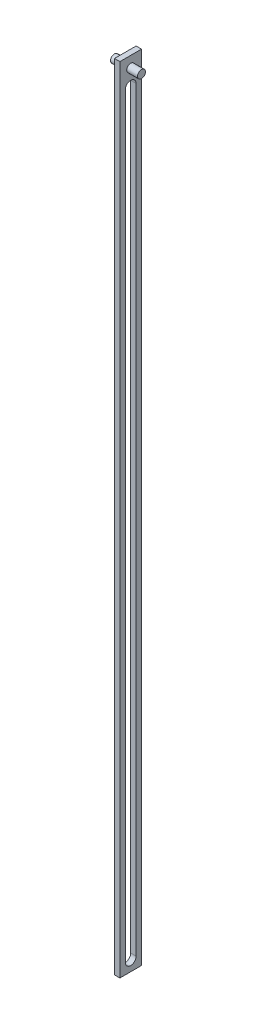
ISO-10303-21;
HEADER;
FILE_DESCRIPTION(('STEP AP214'),'2;1');
FILE_NAME('part.step','',(''),(''),'','','');
FILE_SCHEMA(('AUTOMOTIVE_DESIGN { 1 0 10303 214 1 1 1 1 }'));
ENDSEC;
DATA;
#1=APPLICATION_CONTEXT('core data for automotive mechanical design processes');
#2=APPLICATION_PROTOCOL_DEFINITION('international standard','automotive_design',2000,#1);
#3=PRODUCT_CONTEXT('',#1,'mechanical');
#4=PRODUCT('Part','Part','',(#3));
#5=PRODUCT_RELATED_PRODUCT_CATEGORY('part','',(#4));
#6=PRODUCT_DEFINITION_FORMATION('','',#4);
#7=PRODUCT_DEFINITION_CONTEXT('part definition',#1,'design');
#8=PRODUCT_DEFINITION('design','',#6,#7);
#9=PRODUCT_DEFINITION_SHAPE('','',#8);
#10=(LENGTH_UNIT() NAMED_UNIT(*) SI_UNIT(.MILLI.,.METRE.));
#11=(NAMED_UNIT(*) PLANE_ANGLE_UNIT() SI_UNIT($,.RADIAN.));
#12=(NAMED_UNIT(*) SI_UNIT($,.STERADIAN.) SOLID_ANGLE_UNIT());
#13=UNCERTAINTY_MEASURE_WITH_UNIT(LENGTH_MEASURE(1.E-05),#10,'distance_accuracy_value','');
#14=(GEOMETRIC_REPRESENTATION_CONTEXT(3) GLOBAL_UNCERTAINTY_ASSIGNED_CONTEXT((#13)) GLOBAL_UNIT_ASSIGNED_CONTEXT((#10,
#11,#12)) REPRESENTATION_CONTEXT('',''));
#15=CARTESIAN_POINT('',(0.,0.,0.));
#16=DIRECTION('',(0.,0.,1.));
#17=DIRECTION('',(1.,0.,0.));
#18=AXIS2_PLACEMENT_3D('',#15,#16,#17);
#19=CARTESIAN_POINT('',(3.175,0.,0.));
#20=DIRECTION('',(-1.,0.,0.));
#21=DIRECTION('',(0.,0.,1.));
#22=AXIS2_PLACEMENT_3D('',#19,#20,#21);
#23=PLANE('',#22);
#24=CARTESIAN_POINT('',(3.175,430.048055815008,4.08113084904235));
#25=DIRECTION('',(-1.,0.,0.));
#26=DIRECTION('',(0.,0.,1.));
#27=AXIS2_PLACEMENT_3D('',#24,#25,#26);
#28=CIRCLE('',#27,2.33731121200248);
#29=CARTESIAN_POINT('',(3.175,430.048055815008,1.74381963703987));
#30=VERTEX_POINT('',#29);
#31=EDGE_CURVE('E126',#30,#30,#28,.T.);
#32=ORIENTED_EDGE('',*,*,#31,.T.);
#33=EDGE_LOOP('',(#32));
#34=FACE_BOUND('',#33,.T.);
#35=DIRECTION('',(0.,1.,0.));
#36=VECTOR('',#35,1.);
#37=CARTESIAN_POINT('',(3.175,-30.326944184992,-2.26886915095765));
#38=LINE('',#37,#36);
#39=CARTESIAN_POINT('',(3.175,-30.326944184992,-2.26886915095765));
#40=VERTEX_POINT('',#39);
#41=CARTESIAN_POINT('',(3.175,436.398055815008,-2.26886915095765));
#42=VERTEX_POINT('',#41);
#43=EDGE_CURVE('E100',#40,#42,#38,.T.);
#44=ORIENTED_EDGE('',*,*,#43,.T.);
#45=DIRECTION('',(0.,0.,-1.));
#46=VECTOR('',#45,1.);
#47=CARTESIAN_POINT('',(3.175,436.398055815008,10.4311308490423));
#48=LINE('',#47,#46);
#49=CARTESIAN_POINT('',(3.175,436.398055815008,10.4311308490423));
#50=VERTEX_POINT('',#49);
#51=EDGE_CURVE('E104',#50,#42,#48,.T.);
#52=ORIENTED_EDGE('',*,*,#51,.F.);
#53=DIRECTION('',(0.,-1.,0.));
#54=VECTOR('',#53,1.);
#55=CARTESIAN_POINT('',(3.175,-30.326944184992,10.4311308490423));
#56=LINE('',#55,#54);
#57=CARTESIAN_POINT('',(3.175,-30.326944184992,10.4311308490423));
#58=VERTEX_POINT('',#57);
#59=EDGE_CURVE('E110',#50,#58,#56,.T.);
#60=ORIENTED_EDGE('',*,*,#59,.T.);
#61=DIRECTION('',(0.,0.,-1.));
#62=VECTOR('',#61,1.);
#63=CARTESIAN_POINT('',(3.175,-30.326944184992,10.4311308490423));
#64=LINE('',#63,#62);
#65=EDGE_CURVE('E106',#58,#40,#64,.T.);
#66=ORIENTED_EDGE('',*,*,#65,.T.);
#67=EDGE_LOOP('',(#44,#52,#60,#66));
#68=FACE_BOUND('',#67,.T.);
#69=CARTESIAN_POINT('',(3.175,-23.976944184992,4.08113084904236));
#70=DIRECTION('',(1.,0.,0.));
#71=DIRECTION('',(0.,0.,-1.));
#72=AXIS2_PLACEMENT_3D('',#69,#70,#71);
#73=CIRCLE('',#72,3.175);
#74=CARTESIAN_POINT('',(3.175,-23.976944184992,7.25613084904236));
#75=VERTEX_POINT('',#74);
#76=CARTESIAN_POINT('',(3.175,-23.976944184992,0.906130849042361));
#77=VERTEX_POINT('',#76);
#78=EDGE_CURVE('E135',#75,#77,#73,.T.);
#79=ORIENTED_EDGE('',*,*,#78,.F.);
#80=DIRECTION('',(0.,-1.,0.));
#81=VECTOR('',#80,1.);
#82=CARTESIAN_POINT('',(3.175,-23.976944184992,7.25613084904236));
#83=LINE('',#82,#81);
#84=CARTESIAN_POINT('',(3.175,420.523055815008,7.25613084904244));
#85=VERTEX_POINT('',#84);
#86=EDGE_CURVE('E142',#85,#75,#83,.T.);
#87=ORIENTED_EDGE('',*,*,#86,.F.);
#88=CARTESIAN_POINT('',(3.175,420.523055815008,4.08113084904244));
#89=DIRECTION('',(1.,0.,0.));
#90=DIRECTION('',(0.,0.,-1.));
#91=AXIS2_PLACEMENT_3D('',#88,#89,#90);
#92=CIRCLE('',#91,3.175);
#93=CARTESIAN_POINT('',(3.175,420.523055815008,0.906130849042442));
#94=VERTEX_POINT('',#93);
#95=EDGE_CURVE('E140',#94,#85,#92,.T.);
#96=ORIENTED_EDGE('',*,*,#95,.F.);
#97=DIRECTION('',(0.,1.,0.));
#98=VECTOR('',#97,1.);
#99=CARTESIAN_POINT('',(3.175,-23.976944184992,0.906130849042361));
#100=LINE('',#99,#98);
#101=EDGE_CURVE('E137',#77,#94,#100,.T.);
#102=ORIENTED_EDGE('',*,*,#101,.F.);
#103=EDGE_LOOP('',(#79,#87,#96,#102));
#104=FACE_BOUND('',#103,.T.);
#105=ADVANCED_FACE('F33',(#34,#68,#104),#23,.F.);
#106=CARTESIAN_POINT('',(0.,0.,0.));
#107=DIRECTION('',(-1.,0.,0.));
#108=DIRECTION('',(0.,0.,1.));
#109=AXIS2_PLACEMENT_3D('',#106,#107,#108);
#110=PLANE('',#109);
#111=CARTESIAN_POINT('',(0.,430.048055815008,4.08113084904235));
#112=DIRECTION('',(-1.,0.,0.));
#113=DIRECTION('',(0.,0.,1.));
#114=AXIS2_PLACEMENT_3D('',#111,#112,#113);
#115=CIRCLE('',#114,2.33731121200248);
#116=CARTESIAN_POINT('',(0.,430.048055815008,1.74381963703987));
#117=VERTEX_POINT('',#116);
#118=EDGE_CURVE('E11',#117,#117,#115,.T.);
#119=ORIENTED_EDGE('',*,*,#118,.F.);
#120=EDGE_LOOP('',(#119));
#121=FACE_BOUND('',#120,.T.);
#122=DIRECTION('',(0.,1.,0.));
#123=VECTOR('',#122,1.);
#124=CARTESIAN_POINT('',(0.,-30.326944184992,-2.26886915095765));
#125=LINE('',#124,#123);
#126=CARTESIAN_POINT('',(0.,-30.326944184992,-2.26886915095765));
#127=VERTEX_POINT('',#126);
#128=CARTESIAN_POINT('',(0.,436.398055815008,-2.26886915095765));
#129=VERTEX_POINT('',#128);
#130=EDGE_CURVE('E116',#127,#129,#125,.T.);
#131=ORIENTED_EDGE('',*,*,#130,.F.);
#132=DIRECTION('',(0.,0.,-1.));
#133=VECTOR('',#132,1.);
#134=CARTESIAN_POINT('',(0.,-30.326944184992,10.4311308490423));
#135=LINE('',#134,#133);
#136=CARTESIAN_POINT('',(0.,-30.326944184992,10.4311308490423));
#137=VERTEX_POINT('',#136);
#138=EDGE_CURVE('E111',#137,#127,#135,.T.);
#139=ORIENTED_EDGE('',*,*,#138,.F.);
#140=DIRECTION('',(0.,-1.,0.));
#141=VECTOR('',#140,1.);
#142=CARTESIAN_POINT('',(0.,-30.326944184992,10.4311308490423));
#143=LINE('',#142,#141);
#144=CARTESIAN_POINT('',(0.,436.398055815008,10.4311308490423));
#145=VERTEX_POINT('',#144);
#146=EDGE_CURVE('E164',#145,#137,#143,.T.);
#147=ORIENTED_EDGE('',*,*,#146,.F.);
#148=DIRECTION('',(0.,0.,1.));
#149=VECTOR('',#148,1.);
#150=CARTESIAN_POINT('',(0.,436.398055815008,10.4311308490423));
#151=LINE('',#150,#149);
#152=EDGE_CURVE('E120',#129,#145,#151,.T.);
#153=ORIENTED_EDGE('',*,*,#152,.F.);
#154=EDGE_LOOP('',(#131,#139,#147,#153));
#155=FACE_BOUND('',#154,.T.);
#156=DIRECTION('',(0.,-1.,0.));
#157=VECTOR('',#156,1.);
#158=CARTESIAN_POINT('',(0.,-23.976944184992,7.25613084904236));
#159=LINE('',#158,#157);
#160=CARTESIAN_POINT('',(0.,420.523055815008,7.25613084904244));
#161=VERTEX_POINT('',#160);
#162=CARTESIAN_POINT('',(0.,-23.976944184992,7.25613084904236));
#163=VERTEX_POINT('',#162);
#164=EDGE_CURVE('E138',#161,#163,#159,.T.);
#165=ORIENTED_EDGE('',*,*,#164,.T.);
#166=CARTESIAN_POINT('',(0.,-23.976944184992,4.08113084904236));
#167=DIRECTION('',(1.,0.,0.));
#168=DIRECTION('',(0.,0.,-1.));
#169=AXIS2_PLACEMENT_3D('',#166,#167,#168);
#170=CIRCLE('',#169,3.175);
#171=CARTESIAN_POINT('',(0.,-23.976944184992,0.906130849042361));
#172=VERTEX_POINT('',#171);
#173=EDGE_CURVE('E56',#163,#172,#170,.T.);
#174=ORIENTED_EDGE('',*,*,#173,.T.);
#175=DIRECTION('',(0.,1.,0.));
#176=VECTOR('',#175,1.);
#177=CARTESIAN_POINT('',(0.,-23.976944184992,0.906130849042361));
#178=LINE('',#177,#176);
#179=CARTESIAN_POINT('',(0.,420.523055815008,0.906130849042442));
#180=VERTEX_POINT('',#179);
#181=EDGE_CURVE('E146',#172,#180,#178,.T.);
#182=ORIENTED_EDGE('',*,*,#181,.T.);
#183=CARTESIAN_POINT('',(0.,420.523055815008,4.08113084904244));
#184=DIRECTION('',(1.,0.,0.));
#185=DIRECTION('',(0.,0.,-1.));
#186=AXIS2_PLACEMENT_3D('',#183,#184,#185);
#187=CIRCLE('',#186,3.175);
#188=EDGE_CURVE('E149',#180,#161,#187,.T.);
#189=ORIENTED_EDGE('',*,*,#188,.T.);
#190=EDGE_LOOP('',(#165,#174,#182,#189));
#191=FACE_BOUND('',#190,.T.);
#192=ADVANCED_FACE('F174',(#121,#155,#191),#110,.T.);
#193=CARTESIAN_POINT('',(3.175,-30.326944184992,-2.26886915095765));
#194=DIRECTION('',(0.,0.,1.));
#195=DIRECTION('',(1.,0.,0.));
#196=AXIS2_PLACEMENT_3D('',#193,#194,#195);
#197=PLANE('',#196);
#198=ORIENTED_EDGE('',*,*,#130,.T.);
#199=DIRECTION('',(-1.,0.,0.));
#200=VECTOR('',#199,1.);
#201=CARTESIAN_POINT('',(3.175,436.398055815008,-2.26886915095765));
#202=LINE('',#201,#200);
#203=EDGE_CURVE('E114',#42,#129,#202,.T.);
#204=ORIENTED_EDGE('',*,*,#203,.F.);
#205=ORIENTED_EDGE('',*,*,#43,.F.);
#206=DIRECTION('',(-1.,0.,0.));
#207=VECTOR('',#206,1.);
#208=CARTESIAN_POINT('',(3.175,-30.326944184992,-2.26886915095765));
#209=LINE('',#208,#207);
#210=EDGE_CURVE('E162',#40,#127,#209,.T.);
#211=ORIENTED_EDGE('',*,*,#210,.T.);
#212=EDGE_LOOP('',(#198,#204,#205,#211));
#213=FACE_BOUND('',#212,.T.);
#214=ADVANCED_FACE('F35',(#213),#197,.F.);
#215=CARTESIAN_POINT('',(3.175,-30.326944184992,10.4311308490423));
#216=DIRECTION('',(0.,0.,-1.));
#217=DIRECTION('',(-1.,0.,0.));
#218=AXIS2_PLACEMENT_3D('',#215,#216,#217);
#219=PLANE('',#218);
#220=ORIENTED_EDGE('',*,*,#146,.T.);
#221=DIRECTION('',(-1.,0.,0.));
#222=VECTOR('',#221,1.);
#223=CARTESIAN_POINT('',(3.175,-30.326944184992,10.4311308490423));
#224=LINE('',#223,#222);
#225=EDGE_CURVE('E41',#58,#137,#224,.T.);
#226=ORIENTED_EDGE('',*,*,#225,.F.);
#227=ORIENTED_EDGE('',*,*,#59,.F.);
#228=DIRECTION('',(1.,0.,0.));
#229=VECTOR('',#228,1.);
#230=CARTESIAN_POINT('',(3.175,436.398055815008,10.4311308490423));
#231=LINE('',#230,#229);
#232=EDGE_CURVE('E125',#145,#50,#231,.T.);
#233=ORIENTED_EDGE('',*,*,#232,.F.);
#234=EDGE_LOOP('',(#220,#226,#227,#233));
#235=FACE_BOUND('',#234,.T.);
#236=ADVANCED_FACE('F176',(#235),#219,.F.);
#237=CARTESIAN_POINT('',(3.175,-30.326944184992,10.4311308490423));
#238=DIRECTION('',(0.,1.,0.));
#239=DIRECTION('',(0.,0.,1.));
#240=AXIS2_PLACEMENT_3D('',#237,#238,#239);
#241=PLANE('',#240);
#242=ORIENTED_EDGE('',*,*,#138,.T.);
#243=ORIENTED_EDGE('',*,*,#210,.F.);
#244=ORIENTED_EDGE('',*,*,#65,.F.);
#245=ORIENTED_EDGE('',*,*,#225,.T.);
#246=EDGE_LOOP('',(#242,#243,#244,#245));
#247=FACE_BOUND('',#246,.T.);
#248=ADVANCED_FACE('F171',(#247),#241,.F.);
#249=CARTESIAN_POINT('',(3.175,-23.976944184992,4.08113084904236));
#250=DIRECTION('',(-1.,0.,0.));
#251=DIRECTION('',(0.,0.,1.));
#252=AXIS2_PLACEMENT_3D('',#249,#250,#251);
#253=CYLINDRICAL_SURFACE('',#252,3.175);
#254=ORIENTED_EDGE('',*,*,#173,.F.);
#255=DIRECTION('',(-1.,0.,0.));
#256=VECTOR('',#255,1.);
#257=CARTESIAN_POINT('',(3.175,-23.976944184992,7.25613084904236));
#258=LINE('',#257,#256);
#259=EDGE_CURVE('E144',#75,#163,#258,.T.);
#260=ORIENTED_EDGE('',*,*,#259,.F.);
#261=ORIENTED_EDGE('',*,*,#78,.T.);
#262=DIRECTION('',(-1.,0.,0.));
#263=VECTOR('',#262,1.);
#264=CARTESIAN_POINT('',(3.175,-23.976944184992,0.906130849042361));
#265=LINE('',#264,#263);
#266=EDGE_CURVE('E158',#77,#172,#265,.T.);
#267=ORIENTED_EDGE('',*,*,#266,.T.);
#268=EDGE_LOOP('',(#254,#260,#261,#267));
#269=FACE_BOUND('',#268,.T.);
#270=ADVANCED_FACE('F183',(#269),#253,.F.);
#271=CARTESIAN_POINT('',(3.175,-23.976944184992,0.906130849042361));
#272=DIRECTION('',(0.,0.,1.));
#273=DIRECTION('',(0.,-1.,0.));
#274=AXIS2_PLACEMENT_3D('',#271,#272,#273);
#275=PLANE('',#274);
#276=ORIENTED_EDGE('',*,*,#181,.F.);
#277=ORIENTED_EDGE('',*,*,#266,.F.);
#278=ORIENTED_EDGE('',*,*,#101,.T.);
#279=DIRECTION('',(-1.,0.,0.));
#280=VECTOR('',#279,1.);
#281=CARTESIAN_POINT('',(3.175,420.523055815008,0.906130849042442));
#282=LINE('',#281,#280);
#283=EDGE_CURVE('E156',#94,#180,#282,.T.);
#284=ORIENTED_EDGE('',*,*,#283,.T.);
#285=EDGE_LOOP('',(#276,#277,#278,#284));
#286=FACE_BOUND('',#285,.T.);
#287=ADVANCED_FACE('F197',(#286),#275,.T.);
#288=CARTESIAN_POINT('',(3.175,420.523055815008,4.08113084904244));
#289=DIRECTION('',(-1.,0.,0.));
#290=DIRECTION('',(0.,0.,1.));
#291=AXIS2_PLACEMENT_3D('',#288,#289,#290);
#292=CYLINDRICAL_SURFACE('',#291,3.175);
#293=ORIENTED_EDGE('',*,*,#188,.F.);
#294=ORIENTED_EDGE('',*,*,#283,.F.);
#295=ORIENTED_EDGE('',*,*,#95,.T.);
#296=DIRECTION('',(-1.,0.,0.));
#297=VECTOR('',#296,1.);
#298=CARTESIAN_POINT('',(3.175,420.523055815008,7.25613084904244));
#299=LINE('',#298,#297);
#300=EDGE_CURVE('E48',#85,#161,#299,.T.);
#301=ORIENTED_EDGE('',*,*,#300,.T.);
#302=EDGE_LOOP('',(#293,#294,#295,#301));
#303=FACE_BOUND('',#302,.T.);
#304=ADVANCED_FACE('F200',(#303),#292,.F.);
#305=CARTESIAN_POINT('',(3.175,-23.976944184992,7.25613084904236));
#306=DIRECTION('',(0.,0.,-1.));
#307=DIRECTION('',(0.,1.,0.));
#308=AXIS2_PLACEMENT_3D('',#305,#306,#307);
#309=PLANE('',#308);
#310=ORIENTED_EDGE('',*,*,#164,.F.);
#311=ORIENTED_EDGE('',*,*,#300,.F.);
#312=ORIENTED_EDGE('',*,*,#86,.T.);
#313=ORIENTED_EDGE('',*,*,#259,.T.);
#314=EDGE_LOOP('',(#310,#311,#312,#313));
#315=FACE_BOUND('',#314,.T.);
#316=ADVANCED_FACE('F204',(#315),#309,.T.);
#317=CARTESIAN_POINT('',(0.,436.398055815008,0.));
#318=DIRECTION('',(0.,1.,0.));
#319=DIRECTION('',(0.,0.,1.));
#320=AXIS2_PLACEMENT_3D('',#317,#318,#319);
#321=PLANE('',#320);
#322=ORIENTED_EDGE('',*,*,#51,.T.);
#323=ORIENTED_EDGE('',*,*,#203,.T.);
#324=ORIENTED_EDGE('',*,*,#152,.T.);
#325=ORIENTED_EDGE('',*,*,#232,.T.);
#326=EDGE_LOOP('',(#322,#323,#324,#325));
#327=FACE_BOUND('',#326,.T.);
#328=ADVANCED_FACE('F123',(#327),#321,.T.);
#329=CARTESIAN_POINT('',(-6.35,430.048055815008,4.08113084904235));
#330=DIRECTION('',(1.,0.,0.));
#331=DIRECTION('',(0.,0.,-1.));
#332=AXIS2_PLACEMENT_3D('',#329,#330,#331);
#333=PLANE('',#332);
#334=CARTESIAN_POINT('',(-6.35,430.048055815008,4.08113084904235));
#335=DIRECTION('',(1.,0.,0.));
#336=DIRECTION('',(0.,0.,-1.));
#337=AXIS2_PLACEMENT_3D('',#334,#335,#336);
#338=CIRCLE('',#337,2.33731121200248);
#339=CARTESIAN_POINT('',(-6.35,430.048055815008,1.74381963703987));
#340=VERTEX_POINT('',#339);
#341=EDGE_CURVE('E129',#340,#340,#338,.T.);
#342=ORIENTED_EDGE('',*,*,#341,.F.);
#343=EDGE_LOOP('',(#342));
#344=FACE_BOUND('',#343,.T.);
#345=ADVANCED_FACE('F208',(#344),#333,.F.);
#346=CARTESIAN_POINT('',(-6.35,430.048055815008,4.08113084904235));
#347=DIRECTION('',(1.,0.,0.));
#348=DIRECTION('',(0.,0.,-1.));
#349=AXIS2_PLACEMENT_3D('',#346,#347,#348);
#350=CYLINDRICAL_SURFACE('',#349,2.33731121200248);
#351=CARTESIAN_POINT('',(0.,430.048055815008,1.74381963703987));
#352=CARTESIAN_POINT('',(-0.0661458333333333,430.048055815008,1.74381963703987));
#353=CARTESIAN_POINT('',(-0.132291666666667,430.048055815008,1.74381963703987));
#354=CARTESIAN_POINT('',(-0.264583333333333,430.048055815008,1.74381963703987));
#355=CARTESIAN_POINT('',(-0.330729166666667,430.048055815008,1.74381963703987));
#356=CARTESIAN_POINT('',(-0.463020833333334,430.048055815008,1.74381963703987));
#357=CARTESIAN_POINT('',(-0.529166666666667,430.048055815008,1.74381963703987));
#358=CARTESIAN_POINT('',(-0.661458333333334,430.048055815008,1.74381963703987));
#359=CARTESIAN_POINT('',(-0.727604166666667,430.048055815008,1.74381963703987));
#360=CARTESIAN_POINT('',(-0.859895833333334,430.048055815008,1.74381963703987));
#361=CARTESIAN_POINT('',(-0.926041666666667,430.048055815008,1.74381963703987));
#362=CARTESIAN_POINT('',(-1.05833333333333,430.048055815008,1.74381963703987));
#363=CARTESIAN_POINT('',(-1.12447916666667,430.048055815008,1.74381963703987));
#364=CARTESIAN_POINT('',(-1.25677083333333,430.048055815008,1.74381963703987));
#365=CARTESIAN_POINT('',(-1.32291666666667,430.048055815008,1.74381963703987));
#366=CARTESIAN_POINT('',(-1.45520833333333,430.048055815008,1.74381963703987));
#367=CARTESIAN_POINT('',(-1.52135416666667,430.048055815008,1.74381963703987));
#368=CARTESIAN_POINT('',(-1.65364583333333,430.048055815008,1.74381963703987));
#369=CARTESIAN_POINT('',(-1.71979166666667,430.048055815008,1.74381963703987));
#370=CARTESIAN_POINT('',(-1.85208333333333,430.048055815008,1.74381963703987));
#371=CARTESIAN_POINT('',(-1.91822916666667,430.048055815008,1.74381963703987));
#372=CARTESIAN_POINT('',(-2.05052083333333,430.048055815008,1.74381963703987));
#373=CARTESIAN_POINT('',(-2.11666666666667,430.048055815008,1.74381963703987));
#374=CARTESIAN_POINT('',(-2.24895833333333,430.048055815008,1.74381963703987));
#375=CARTESIAN_POINT('',(-2.31510416666667,430.048055815008,1.74381963703987));
#376=CARTESIAN_POINT('',(-2.44739583333333,430.048055815008,1.74381963703987));
#377=CARTESIAN_POINT('',(-2.51354166666667,430.048055815008,1.74381963703987));
#378=CARTESIAN_POINT('',(-2.64583333333333,430.048055815008,1.74381963703987));
#379=CARTESIAN_POINT('',(-2.71197916666667,430.048055815008,1.74381963703987));
#380=CARTESIAN_POINT('',(-2.84427083333333,430.048055815008,1.74381963703987));
#381=CARTESIAN_POINT('',(-2.91041666666667,430.048055815008,1.74381963703987));
#382=CARTESIAN_POINT('',(-3.04270833333333,430.048055815008,1.74381963703987));
#383=CARTESIAN_POINT('',(-3.10885416666667,430.048055815008,1.74381963703987));
#384=CARTESIAN_POINT('',(-3.24114583333333,430.048055815008,1.74381963703987));
#385=CARTESIAN_POINT('',(-3.30729166666667,430.048055815008,1.74381963703987));
#386=CARTESIAN_POINT('',(-3.43958333333333,430.048055815008,1.74381963703987));
#387=CARTESIAN_POINT('',(-3.50572916666667,430.048055815008,1.74381963703987));
#388=CARTESIAN_POINT('',(-3.63802083333333,430.048055815008,1.74381963703987));
#389=CARTESIAN_POINT('',(-3.70416666666667,430.048055815008,1.74381963703987));
#390=CARTESIAN_POINT('',(-3.83645833333333,430.048055815008,1.74381963703987));
#391=CARTESIAN_POINT('',(-3.90260416666667,430.048055815008,1.74381963703987));
#392=CARTESIAN_POINT('',(-4.03489583333333,430.048055815008,1.74381963703987));
#393=CARTESIAN_POINT('',(-4.10104166666667,430.048055815008,1.74381963703987));
#394=CARTESIAN_POINT('',(-4.23333333333333,430.048055815008,1.74381963703987));
#395=CARTESIAN_POINT('',(-4.29947916666667,430.048055815008,1.74381963703987));
#396=CARTESIAN_POINT('',(-4.43177083333333,430.048055815008,1.74381963703987));
#397=CARTESIAN_POINT('',(-4.49791666666667,430.048055815008,1.74381963703987));
#398=CARTESIAN_POINT('',(-4.63020833333333,430.048055815008,1.74381963703987));
#399=CARTESIAN_POINT('',(-4.69635416666667,430.048055815008,1.74381963703987));
#400=CARTESIAN_POINT('',(-4.82864583333333,430.048055815008,1.74381963703987));
#401=CARTESIAN_POINT('',(-4.89479166666667,430.048055815008,1.74381963703987));
#402=CARTESIAN_POINT('',(-5.02708333333333,430.048055815008,1.74381963703987));
#403=CARTESIAN_POINT('',(-5.09322916666667,430.048055815008,1.74381963703987));
#404=CARTESIAN_POINT('',(-5.22552083333333,430.048055815008,1.74381963703987));
#405=CARTESIAN_POINT('',(-5.29166666666667,430.048055815008,1.74381963703987));
#406=CARTESIAN_POINT('',(-5.42395833333333,430.048055815008,1.74381963703987));
#407=CARTESIAN_POINT('',(-5.49010416666667,430.048055815008,1.74381963703987));
#408=CARTESIAN_POINT('',(-5.62239583333333,430.048055815008,1.74381963703987));
#409=CARTESIAN_POINT('',(-5.68854166666667,430.048055815008,1.74381963703987));
#410=CARTESIAN_POINT('',(-5.82083333333333,430.048055815008,1.74381963703987));
#411=CARTESIAN_POINT('',(-5.88697916666667,430.048055815008,1.74381963703987));
#412=CARTESIAN_POINT('',(-6.01927083333333,430.048055815008,1.74381963703987));
#413=CARTESIAN_POINT('',(-6.08541666666667,430.048055815008,1.74381963703987));
#414=CARTESIAN_POINT('',(-6.21770833333333,430.048055815008,1.74381963703987));
#415=CARTESIAN_POINT('',(-6.28385416666667,430.048055815008,1.74381963703987));
#416=CARTESIAN_POINT('',(-6.35,430.048055815008,1.74381963703987));
#417=B_SPLINE_CURVE_WITH_KNOTS('',3,(#351,#352,#353,#354,#355,#356,#357,#358,#359,#360,#361,
#362,#363,#364,#365,#366,#367,#368,#369,#370,#371,#372,#373,#374,#375,#376,#377,#378,#379,#380,
#381,#382,#383,#384,#385,#386,#387,#388,#389,#390,#391,#392,#393,#394,#395,#396,#397,#398,#399,
#400,#401,#402,#403,#404,#405,#406,#407,#408,#409,#410,#411,#412,#413,#414,#415,#416),
.UNSPECIFIED.,.F.,.F.,(4,2,2,2,2,2,2,2,2,2,2,2,2,2,2,2,2,2,2,2,2,2,2,2,2,2,2,2,2,2,2,2,4),(0.,
0.1984375,0.396875000000001,0.5953125,0.79375,0.9921875,1.190625,1.3890625,1.5875,1.7859375,
1.984375,2.1828125,2.38125,2.5796875,2.778125,2.9765625,3.175,3.3734375,3.571875,3.7703125,
3.96875,4.1671875,4.365625,4.5640625,4.7625,4.9609375,5.159375,5.3578125,5.55625,5.7546875,
5.953125,6.1515625,6.35),.UNSPECIFIED.);
#418=EDGE_CURVE('BSEAM209',#117,#340,#417,.T.);
#419=ORIENTED_EDGE('',*,*,#118,.T.);
#420=ORIENTED_EDGE('',*,*,#341,.T.);
#421=ORIENTED_EDGE('',*,*,#418,.T.);
#422=ORIENTED_EDGE('',*,*,#418,.F.);
#423=EDGE_LOOP('',(#419,#421,#420,#422));
#424=FACE_BOUND('',#423,.T.);
#425=ADVANCED_FACE('F209',(#424),#350,.T.);
#426=CARTESIAN_POINT('',(9.525,430.048055815008,4.08113084904235));
#427=DIRECTION('',(1.,0.,0.));
#428=DIRECTION('',(0.,0.,-1.));
#429=AXIS2_PLACEMENT_3D('',#426,#427,#428);
#430=CIRCLE('',#429,2.33731121200248);
#431=CARTESIAN_POINT('',(9.525,430.048055815008,1.74381963703987));
#432=VERTEX_POINT('',#431);
#433=EDGE_CURVE('E226',#432,#432,#430,.T.);
#434=CARTESIAN_POINT('',(9.525,430.048055815008,1.74381963703987));
#435=CARTESIAN_POINT('',(9.45885416666666,430.048055815008,1.74381963703987));
#436=CARTESIAN_POINT('',(9.39270833333333,430.048055815008,1.74381963703987));
#437=CARTESIAN_POINT('',(9.26041666666666,430.048055815008,1.74381963703987));
#438=CARTESIAN_POINT('',(9.19427083333333,430.048055815008,1.74381963703987));
#439=CARTESIAN_POINT('',(9.06197916666666,430.048055815008,1.74381963703987));
#440=CARTESIAN_POINT('',(8.99583333333333,430.048055815008,1.74381963703987));
#441=CARTESIAN_POINT('',(8.86354166666666,430.048055815008,1.74381963703987));
#442=CARTESIAN_POINT('',(8.79739583333333,430.048055815008,1.74381963703987));
#443=CARTESIAN_POINT('',(8.66510416666666,430.048055815008,1.74381963703987));
#444=CARTESIAN_POINT('',(8.59895833333333,430.048055815008,1.74381963703987));
#445=CARTESIAN_POINT('',(8.46666666666666,430.048055815008,1.74381963703987));
#446=CARTESIAN_POINT('',(8.40052083333333,430.048055815008,1.74381963703987));
#447=CARTESIAN_POINT('',(8.26822916666666,430.048055815008,1.74381963703987));
#448=CARTESIAN_POINT('',(8.20208333333333,430.048055815008,1.74381963703987));
#449=CARTESIAN_POINT('',(8.06979166666667,430.048055815008,1.74381963703987));
#450=CARTESIAN_POINT('',(8.00364583333333,430.048055815008,1.74381963703987));
#451=CARTESIAN_POINT('',(7.87135416666667,430.048055815008,1.74381963703987));
#452=CARTESIAN_POINT('',(7.80520833333333,430.048055815008,1.74381963703987));
#453=CARTESIAN_POINT('',(7.67291666666666,430.048055815008,1.74381963703987));
#454=CARTESIAN_POINT('',(7.60677083333333,430.048055815008,1.74381963703987));
#455=CARTESIAN_POINT('',(7.47447916666667,430.048055815008,1.74381963703987));
#456=CARTESIAN_POINT('',(7.40833333333333,430.048055815008,1.74381963703987));
#457=CARTESIAN_POINT('',(7.27604166666667,430.048055815008,1.74381963703987));
#458=CARTESIAN_POINT('',(7.20989583333333,430.048055815008,1.74381963703987));
#459=CARTESIAN_POINT('',(7.07760416666667,430.048055815008,1.74381963703987));
#460=CARTESIAN_POINT('',(7.01145833333333,430.048055815008,1.74381963703987));
#461=CARTESIAN_POINT('',(6.87916666666667,430.048055815008,1.74381963703987));
#462=CARTESIAN_POINT('',(6.81302083333333,430.048055815008,1.74381963703987));
#463=CARTESIAN_POINT('',(6.68072916666667,430.048055815008,1.74381963703987));
#464=CARTESIAN_POINT('',(6.61458333333333,430.048055815008,1.74381963703987));
#465=CARTESIAN_POINT('',(6.48229166666667,430.048055815008,1.74381963703987));
#466=CARTESIAN_POINT('',(6.41614583333333,430.048055815008,1.74381963703987));
#467=CARTESIAN_POINT('',(6.28385416666667,430.048055815008,1.74381963703987));
#468=CARTESIAN_POINT('',(6.21770833333333,430.048055815008,1.74381963703987));
#469=CARTESIAN_POINT('',(6.08541666666667,430.048055815008,1.74381963703987));
#470=CARTESIAN_POINT('',(6.01927083333333,430.048055815008,1.74381963703987));
#471=CARTESIAN_POINT('',(5.88697916666667,430.048055815008,1.74381963703987));
#472=CARTESIAN_POINT('',(5.82083333333333,430.048055815008,1.74381963703987));
#473=CARTESIAN_POINT('',(5.68854166666667,430.048055815008,1.74381963703987));
#474=CARTESIAN_POINT('',(5.62239583333333,430.048055815008,1.74381963703987));
#475=CARTESIAN_POINT('',(5.49010416666667,430.048055815008,1.74381963703987));
#476=CARTESIAN_POINT('',(5.42395833333333,430.048055815008,1.74381963703987));
#477=CARTESIAN_POINT('',(5.29166666666667,430.048055815008,1.74381963703987));
#478=CARTESIAN_POINT('',(5.22552083333333,430.048055815008,1.74381963703987));
#479=CARTESIAN_POINT('',(5.09322916666667,430.048055815008,1.74381963703987));
#480=CARTESIAN_POINT('',(5.02708333333333,430.048055815008,1.74381963703987));
#481=CARTESIAN_POINT('',(4.89479166666667,430.048055815008,1.74381963703987));
#482=CARTESIAN_POINT('',(4.82864583333333,430.048055815008,1.74381963703987));
#483=CARTESIAN_POINT('',(4.69635416666667,430.048055815008,1.74381963703987));
#484=CARTESIAN_POINT('',(4.63020833333333,430.048055815008,1.74381963703987));
#485=CARTESIAN_POINT('',(4.49791666666667,430.048055815008,1.74381963703987));
#486=CARTESIAN_POINT('',(4.43177083333333,430.048055815008,1.74381963703987));
#487=CARTESIAN_POINT('',(4.29947916666667,430.048055815008,1.74381963703987));
#488=CARTESIAN_POINT('',(4.23333333333333,430.048055815008,1.74381963703987));
#489=CARTESIAN_POINT('',(4.10104166666667,430.048055815008,1.74381963703987));
#490=CARTESIAN_POINT('',(4.03489583333333,430.048055815008,1.74381963703987));
#491=CARTESIAN_POINT('',(3.90260416666667,430.048055815008,1.74381963703987));
#492=CARTESIAN_POINT('',(3.83645833333333,430.048055815008,1.74381963703987));
#493=CARTESIAN_POINT('',(3.70416666666667,430.048055815008,1.74381963703987));
#494=CARTESIAN_POINT('',(3.63802083333333,430.048055815008,1.74381963703987));
#495=CARTESIAN_POINT('',(3.50572916666667,430.048055815008,1.74381963703987));
#496=CARTESIAN_POINT('',(3.43958333333333,430.048055815008,1.74381963703987));
#497=CARTESIAN_POINT('',(3.30729166666667,430.048055815008,1.74381963703987));
#498=CARTESIAN_POINT('',(3.24114583333333,430.048055815008,1.74381963703987));
#499=CARTESIAN_POINT('',(3.175,430.048055815008,1.74381963703987));
#500=B_SPLINE_CURVE_WITH_KNOTS('',3,(#434,#435,#436,#437,#438,#439,#440,#441,#442,#443,#444,
#445,#446,#447,#448,#449,#450,#451,#452,#453,#454,#455,#456,#457,#458,#459,#460,#461,#462,#463,
#464,#465,#466,#467,#468,#469,#470,#471,#472,#473,#474,#475,#476,#477,#478,#479,#480,#481,#482,
#483,#484,#485,#486,#487,#488,#489,#490,#491,#492,#493,#494,#495,#496,#497,#498,#499),
.UNSPECIFIED.,.F.,.F.,(4,2,2,2,2,2,2,2,2,2,2,2,2,2,2,2,2,2,2,2,2,2,2,2,2,2,2,2,2,2,2,2,4),(0.,
0.198437499999999,0.396874999999998,0.595312499999997,0.793749999999996,0.992187499999998,
1.190625,1.3890625,1.5875,1.7859375,1.984375,2.1828125,2.38125,2.5796875,2.778125,2.9765625,
3.175,3.3734375,3.571875,3.7703125,3.96875,4.1671875,4.365625,4.5640625,4.7625,4.9609375,
5.15937499999999,5.3578125,5.55625,5.75468749999999,5.953125,6.1515625,6.35),.UNSPECIFIED.);
#501=EDGE_CURVE('BSEAM212',#432,#30,#500,.T.);
#502=ORIENTED_EDGE('',*,*,#433,.F.);
#503=ORIENTED_EDGE('',*,*,#31,.F.);
#504=ORIENTED_EDGE('',*,*,#501,.T.);
#505=ORIENTED_EDGE('',*,*,#501,.F.);
#506=EDGE_LOOP('',(#502,#504,#503,#505));
#507=FACE_BOUND('',#506,.T.);
#508=ADVANCED_FACE('F212',(#507),#350,.T.);
#509=CARTESIAN_POINT('',(9.525,430.048055815008,4.08113084904235));
#510=DIRECTION('',(1.,0.,0.));
#511=DIRECTION('',(0.,0.,-1.));
#512=AXIS2_PLACEMENT_3D('',#509,#510,#511);
#513=PLANE('',#512);
#514=ORIENTED_EDGE('',*,*,#433,.T.);
#515=EDGE_LOOP('',(#514));
#516=FACE_BOUND('',#515,.T.);
#517=ADVANCED_FACE('F217',(#516),#513,.T.);
#518=CLOSED_SHELL('',(#105,#192,#214,#236,#248,#270,#287,#304,#316,#328,#345,#425,#508,#517));
#519=MANIFOLD_SOLID_BREP('B2',#518);
#520=ADVANCED_BREP_SHAPE_REPRESENTATION('',(#18,#519),#14);
#521=SHAPE_DEFINITION_REPRESENTATION(#9,#520);
ENDSEC;
END-ISO-10303-21;
